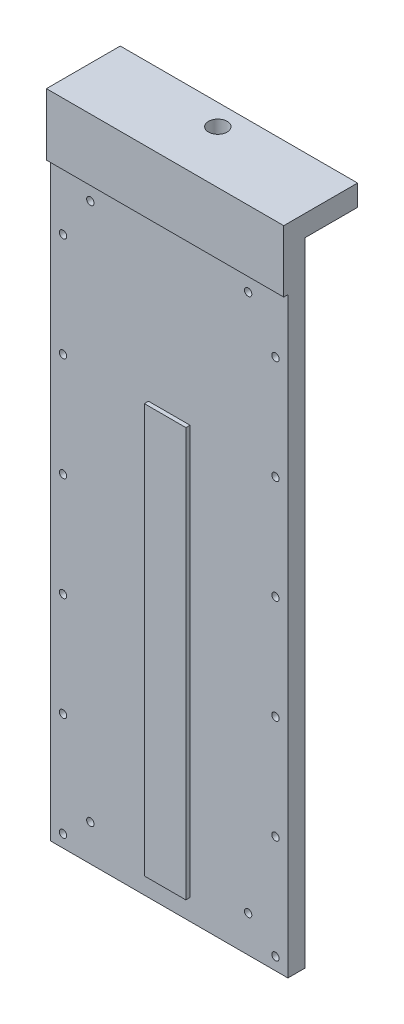
ISO-10303-21;
HEADER;
FILE_DESCRIPTION(('STEP AP214'),'2;1');
FILE_NAME('part.step','',(''),(''),'','','');
FILE_SCHEMA(('AUTOMOTIVE_DESIGN { 1 0 10303 214 1 1 1 1 }'));
ENDSEC;
DATA;
#1=APPLICATION_CONTEXT('core data for automotive mechanical design processes');
#2=APPLICATION_PROTOCOL_DEFINITION('international standard','automotive_design',2000,#1);
#3=PRODUCT_CONTEXT('',#1,'mechanical');
#4=PRODUCT('Part','Part','',(#3));
#5=PRODUCT_RELATED_PRODUCT_CATEGORY('part','',(#4));
#6=PRODUCT_DEFINITION_FORMATION('','',#4);
#7=PRODUCT_DEFINITION_CONTEXT('part definition',#1,'design');
#8=PRODUCT_DEFINITION('design','',#6,#7);
#9=PRODUCT_DEFINITION_SHAPE('','',#8);
#10=(LENGTH_UNIT() NAMED_UNIT(*) SI_UNIT(.MILLI.,.METRE.));
#11=(NAMED_UNIT(*) PLANE_ANGLE_UNIT() SI_UNIT($,.RADIAN.));
#12=(NAMED_UNIT(*) SI_UNIT($,.STERADIAN.) SOLID_ANGLE_UNIT());
#13=UNCERTAINTY_MEASURE_WITH_UNIT(LENGTH_MEASURE(1.E-05),#10,'distance_accuracy_value','');
#14=(GEOMETRIC_REPRESENTATION_CONTEXT(3) GLOBAL_UNCERTAINTY_ASSIGNED_CONTEXT((#13)) GLOBAL_UNIT_ASSIGNED_CONTEXT((#10,
#11,#12)) REPRESENTATION_CONTEXT('',''));
#15=CARTESIAN_POINT('',(0.,0.,0.));
#16=DIRECTION('',(0.,0.,1.));
#17=DIRECTION('',(1.,0.,0.));
#18=AXIS2_PLACEMENT_3D('',#15,#16,#17);
#19=CARTESIAN_POINT('',(-28.575,-152.4,2.54));
#20=DIRECTION('',(0.,0.,1.));
#21=DIRECTION('',(1.,0.,0.));
#22=AXIS2_PLACEMENT_3D('',#19,#20,#21);
#23=PLANE('',#22);
#24=DIRECTION('',(-1.,0.,0.));
#25=VECTOR('',#24,1.);
#26=CARTESIAN_POINT('',(28.575,-14.9,2.54));
#27=LINE('',#26,#25);
#28=CARTESIAN_POINT('',(28.575,-14.9,2.54));
#29=VERTEX_POINT('',#28);
#30=CARTESIAN_POINT('',(-28.575,-14.9,2.54));
#31=VERTEX_POINT('',#30);
#32=EDGE_CURVE('E240',#29,#31,#27,.T.);
#33=ORIENTED_EDGE('',*,*,#32,.F.);
#34=DIRECTION('',(0.,1.,0.));
#35=VECTOR('',#34,1.);
#36=CARTESIAN_POINT('',(28.575,-152.4,2.54));
#37=LINE('',#36,#35);
#38=CARTESIAN_POINT('',(28.575,0.,2.54));
#39=VERTEX_POINT('',#38);
#40=EDGE_CURVE('E53',#29,#39,#37,.T.);
#41=ORIENTED_EDGE('',*,*,#40,.T.);
#42=DIRECTION('',(1.,0.,0.));
#43=VECTOR('',#42,1.);
#44=CARTESIAN_POINT('',(-28.575,0.,2.54));
#45=LINE('',#44,#43);
#46=CARTESIAN_POINT('',(-28.575,0.,2.54));
#47=VERTEX_POINT('',#46);
#48=EDGE_CURVE('E295',#47,#39,#45,.T.);
#49=ORIENTED_EDGE('',*,*,#48,.F.);
#50=DIRECTION('',(0.,1.,0.));
#51=VECTOR('',#50,1.);
#52=CARTESIAN_POINT('',(-28.575,-152.4,2.54));
#53=LINE('',#52,#51);
#54=EDGE_CURVE('E146',#31,#47,#53,.T.);
#55=ORIENTED_EDGE('',*,*,#54,.F.);
#56=EDGE_LOOP('',(#33,#41,#49,#55));
#57=FACE_BOUND('',#56,.T.);
#58=ADVANCED_FACE('F43',(#57),#23,.T.);
#59=CARTESIAN_POINT('',(28.575,-152.4,2.54));
#60=DIRECTION('',(1.,0.,0.));
#61=DIRECTION('',(0.,0.,-1.));
#62=AXIS2_PLACEMENT_3D('',#59,#60,#61);
#63=PLANE('',#62);
#64=DIRECTION('',(0.,0.,1.));
#65=VECTOR('',#64,1.);
#66=CARTESIAN_POINT('',(28.575,-14.9,1.54));
#67=LINE('',#66,#65);
#68=CARTESIAN_POINT('',(28.575,-14.9,1.54));
#69=VERTEX_POINT('',#68);
#70=EDGE_CURVE('E276',#69,#29,#67,.T.);
#71=ORIENTED_EDGE('',*,*,#70,.F.);
#72=DIRECTION('',(0.,1.,0.));
#73=VECTOR('',#72,1.);
#74=CARTESIAN_POINT('',(28.575,-152.4,1.54));
#75=LINE('',#74,#73);
#76=CARTESIAN_POINT('',(28.575,-157.4,1.54));
#77=VERTEX_POINT('',#76);
#78=EDGE_CURVE('E248',#77,#69,#75,.T.);
#79=ORIENTED_EDGE('',*,*,#78,.F.);
#80=DIRECTION('',(0.,0.,1.));
#81=VECTOR('',#80,1.);
#82=CARTESIAN_POINT('',(28.575,-157.4,-2.54));
#83=LINE('',#82,#81);
#84=CARTESIAN_POINT('',(28.575,-157.4,-2.54));
#85=VERTEX_POINT('',#84);
#86=EDGE_CURVE('E156',#85,#77,#83,.T.);
#87=ORIENTED_EDGE('',*,*,#86,.F.);
#88=DIRECTION('',(0.,1.,0.));
#89=VECTOR('',#88,1.);
#90=CARTESIAN_POINT('',(28.575,-152.4,-2.54));
#91=LINE('',#90,#89);
#92=CARTESIAN_POINT('',(28.575,-5.08000000000006,-2.54));
#93=VERTEX_POINT('',#92);
#94=EDGE_CURVE('E147',#85,#93,#91,.T.);
#95=ORIENTED_EDGE('',*,*,#94,.T.);
#96=DIRECTION('',(0.,0.,1.));
#97=VECTOR('',#96,1.);
#98=CARTESIAN_POINT('',(28.575,-5.08,-15.24));
#99=LINE('',#98,#97);
#100=CARTESIAN_POINT('',(28.575,-5.08,-15.24));
#101=VERTEX_POINT('',#100);
#102=EDGE_CURVE('E230',#101,#93,#99,.T.);
#103=ORIENTED_EDGE('',*,*,#102,.F.);
#104=DIRECTION('',(0.,-1.,0.));
#105=VECTOR('',#104,1.);
#106=CARTESIAN_POINT('',(28.575,0.,-15.24));
#107=LINE('',#106,#105);
#108=CARTESIAN_POINT('',(28.575,0.,-15.24));
#109=VERTEX_POINT('',#108);
#110=EDGE_CURVE('E211',#109,#101,#107,.T.);
#111=ORIENTED_EDGE('',*,*,#110,.F.);
#112=DIRECTION('',(0.,0.,-1.));
#113=VECTOR('',#112,1.);
#114=CARTESIAN_POINT('',(28.575,0.,2.54));
#115=LINE('',#114,#113);
#116=EDGE_CURVE('E275',#39,#109,#115,.T.);
#117=ORIENTED_EDGE('',*,*,#116,.F.);
#118=ORIENTED_EDGE('',*,*,#40,.F.);
#119=EDGE_LOOP('',(#71,#79,#87,#95,#103,#111,#117,#118));
#120=FACE_BOUND('',#119,.T.);
#121=ADVANCED_FACE('F45',(#120),#63,.T.);
#122=DIRECTION('',(0.,-1.,0.));
#123=VECTOR('',#122,1.);
#124=CARTESIAN_POINT('',(5.,-53.9,2.54));
#125=LINE('',#124,#123);
#126=CARTESIAN_POINT('',(5.,-53.9,2.54));
#127=VERTEX_POINT('',#126);
#128=CARTESIAN_POINT('',(5.,-152.4,2.54));
#129=VERTEX_POINT('',#128);
#130=EDGE_CURVE('E267',#127,#129,#125,.T.);
#131=ORIENTED_EDGE('',*,*,#130,.F.);
#132=DIRECTION('',(1.,0.,0.));
#133=VECTOR('',#132,1.);
#134=CARTESIAN_POINT('',(-5.,-53.9,2.54));
#135=LINE('',#134,#133);
#136=CARTESIAN_POINT('',(-5.,-53.9,2.54));
#137=VERTEX_POINT('',#136);
#138=EDGE_CURVE('E263',#137,#127,#135,.T.);
#139=ORIENTED_EDGE('',*,*,#138,.F.);
#140=DIRECTION('',(0.,1.,0.));
#141=VECTOR('',#140,1.);
#142=CARTESIAN_POINT('',(-5.,-152.4,2.54));
#143=LINE('',#142,#141);
#144=CARTESIAN_POINT('',(-5.,-152.4,2.54));
#145=VERTEX_POINT('',#144);
#146=EDGE_CURVE('E234',#145,#137,#143,.T.);
#147=ORIENTED_EDGE('',*,*,#146,.F.);
#148=DIRECTION('',(1.,0.,0.));
#149=VECTOR('',#148,1.);
#150=CARTESIAN_POINT('',(-28.575,-152.4,2.54));
#151=LINE('',#150,#149);
#152=EDGE_CURVE('E291',#145,#129,#151,.T.);
#153=ORIENTED_EDGE('',*,*,#152,.T.);
#154=EDGE_LOOP('',(#131,#139,#147,#153));
#155=FACE_BOUND('',#154,.T.);
#156=ADVANCED_FACE('F351',(#155),#23,.T.);
#157=CARTESIAN_POINT('',(-28.575,-152.4,2.54));
#158=DIRECTION('',(-1.,0.,0.));
#159=DIRECTION('',(0.,0.,1.));
#160=AXIS2_PLACEMENT_3D('',#157,#158,#159);
#161=PLANE('',#160);
#162=DIRECTION('',(0.,0.,1.));
#163=VECTOR('',#162,1.);
#164=CARTESIAN_POINT('',(-28.575,-14.9,1.54));
#165=LINE('',#164,#163);
#166=CARTESIAN_POINT('',(-28.575,-14.9,1.54));
#167=VERTEX_POINT('',#166);
#168=EDGE_CURVE('E272',#167,#31,#165,.T.);
#169=ORIENTED_EDGE('',*,*,#168,.T.);
#170=ORIENTED_EDGE('',*,*,#54,.T.);
#171=DIRECTION('',(0.,0.,1.));
#172=VECTOR('',#171,1.);
#173=CARTESIAN_POINT('',(-28.575,0.,2.54));
#174=LINE('',#173,#172);
#175=CARTESIAN_POINT('',(-28.575,0.,-15.24));
#176=VERTEX_POINT('',#175);
#177=EDGE_CURVE('E298',#176,#47,#174,.T.);
#178=ORIENTED_EDGE('',*,*,#177,.F.);
#179=DIRECTION('',(0.,1.,0.));
#180=VECTOR('',#179,1.);
#181=CARTESIAN_POINT('',(-28.575,0.,-15.24));
#182=LINE('',#181,#180);
#183=CARTESIAN_POINT('',(-28.575,-5.08,-15.24));
#184=VERTEX_POINT('',#183);
#185=EDGE_CURVE('E218',#184,#176,#182,.T.);
#186=ORIENTED_EDGE('',*,*,#185,.F.);
#187=DIRECTION('',(0.,0.,1.));
#188=VECTOR('',#187,1.);
#189=CARTESIAN_POINT('',(-28.575,-5.08,-15.24));
#190=LINE('',#189,#188);
#191=CARTESIAN_POINT('',(-28.575,-5.08,-2.54));
#192=VERTEX_POINT('',#191);
#193=EDGE_CURVE('E144',#184,#192,#190,.T.);
#194=ORIENTED_EDGE('',*,*,#193,.T.);
#195=DIRECTION('',(0.,1.,0.));
#196=VECTOR('',#195,1.);
#197=CARTESIAN_POINT('',(-28.575,-152.4,-2.54));
#198=LINE('',#197,#196);
#199=CARTESIAN_POINT('',(-28.575,-157.4,-2.54));
#200=VERTEX_POINT('',#199);
#201=EDGE_CURVE('E135',#200,#192,#198,.T.);
#202=ORIENTED_EDGE('',*,*,#201,.F.);
#203=DIRECTION('',(0.,0.,-1.));
#204=VECTOR('',#203,1.);
#205=CARTESIAN_POINT('',(-28.575,-157.4,-2.54));
#206=LINE('',#205,#204);
#207=CARTESIAN_POINT('',(-28.575,-157.4,1.54));
#208=VERTEX_POINT('',#207);
#209=EDGE_CURVE('E141',#208,#200,#206,.T.);
#210=ORIENTED_EDGE('',*,*,#209,.F.);
#211=DIRECTION('',(0.,-1.,0.));
#212=VECTOR('',#211,1.);
#213=CARTESIAN_POINT('',(-28.575,-14.9,1.54));
#214=LINE('',#213,#212);
#215=EDGE_CURVE('E256',#167,#208,#214,.T.);
#216=ORIENTED_EDGE('',*,*,#215,.F.);
#217=EDGE_LOOP('',(#169,#170,#178,#186,#194,#202,#210,#216));
#218=FACE_BOUND('',#217,.T.);
#219=ADVANCED_FACE('F138',(#218),#161,.T.);
#220=CARTESIAN_POINT('',(-28.575,-152.4,-2.54));
#221=DIRECTION('',(0.,0.,-1.));
#222=DIRECTION('',(-1.,0.,0.));
#223=AXIS2_PLACEMENT_3D('',#220,#221,#222);
#224=PLANE('',#223);
#225=CARTESIAN_POINT('',(-25.575,-29.4,-2.54));
#226=DIRECTION('',(0.,0.,-1.));
#227=DIRECTION('',(-1.,0.,0.));
#228=AXIS2_PLACEMENT_3D('',#225,#226,#227);
#229=CIRCLE('',#228,0.88900000000001);
#230=CARTESIAN_POINT('',(-26.464,-29.4,-2.54));
#231=VERTEX_POINT('',#230);
#232=EDGE_CURVE('E386',#231,#231,#229,.T.);
#233=ORIENTED_EDGE('',*,*,#232,.F.);
#234=EDGE_LOOP('',(#233));
#235=FACE_BOUND('',#234,.T.);
#236=CARTESIAN_POINT('',(-25.575,-54.4,-2.54));
#237=DIRECTION('',(0.,0.,-1.));
#238=DIRECTION('',(-1.,0.,0.));
#239=AXIS2_PLACEMENT_3D('',#236,#237,#238);
#240=CIRCLE('',#239,0.88900000000001);
#241=CARTESIAN_POINT('',(-26.464,-54.4,-2.54));
#242=VERTEX_POINT('',#241);
#243=EDGE_CURVE('E390',#242,#242,#240,.T.);
#244=ORIENTED_EDGE('',*,*,#243,.F.);
#245=EDGE_LOOP('',(#244));
#246=FACE_BOUND('',#245,.T.);
#247=CARTESIAN_POINT('',(-25.575,-79.4,-2.54));
#248=DIRECTION('',(0.,0.,-1.));
#249=DIRECTION('',(-1.,0.,0.));
#250=AXIS2_PLACEMENT_3D('',#247,#248,#249);
#251=CIRCLE('',#250,0.88900000000001);
#252=CARTESIAN_POINT('',(-26.464,-79.4,-2.54));
#253=VERTEX_POINT('',#252);
#254=EDGE_CURVE('E394',#253,#253,#251,.T.);
#255=ORIENTED_EDGE('',*,*,#254,.F.);
#256=EDGE_LOOP('',(#255));
#257=FACE_BOUND('',#256,.T.);
#258=CARTESIAN_POINT('',(-25.575,-104.4,-2.54));
#259=DIRECTION('',(0.,0.,-1.));
#260=DIRECTION('',(-1.,0.,0.));
#261=AXIS2_PLACEMENT_3D('',#258,#259,#260);
#262=CIRCLE('',#261,0.88900000000001);
#263=CARTESIAN_POINT('',(-26.464,-104.4,-2.54));
#264=VERTEX_POINT('',#263);
#265=EDGE_CURVE('E398',#264,#264,#262,.T.);
#266=ORIENTED_EDGE('',*,*,#265,.F.);
#267=EDGE_LOOP('',(#266));
#268=FACE_BOUND('',#267,.T.);
#269=CARTESIAN_POINT('',(-25.575,-129.4,-2.54));
#270=DIRECTION('',(0.,0.,-1.));
#271=DIRECTION('',(-1.,0.,0.));
#272=AXIS2_PLACEMENT_3D('',#269,#270,#271);
#273=CIRCLE('',#272,0.88900000000001);
#274=CARTESIAN_POINT('',(-26.464,-129.4,-2.54));
#275=VERTEX_POINT('',#274);
#276=EDGE_CURVE('E402',#275,#275,#273,.T.);
#277=ORIENTED_EDGE('',*,*,#276,.F.);
#278=EDGE_LOOP('',(#277));
#279=FACE_BOUND('',#278,.T.);
#280=CARTESIAN_POINT('',(25.575,-29.4,-2.54));
#281=DIRECTION('',(0.,0.,-1.));
#282=DIRECTION('',(-1.,0.,0.));
#283=AXIS2_PLACEMENT_3D('',#280,#281,#282);
#284=CIRCLE('',#283,0.88900000000001);
#285=CARTESIAN_POINT('',(24.686,-29.4,-2.54));
#286=VERTEX_POINT('',#285);
#287=EDGE_CURVE('E406',#286,#286,#284,.F.);
#288=ORIENTED_EDGE('',*,*,#287,.T.);
#289=EDGE_LOOP('',(#288));
#290=FACE_BOUND('',#289,.T.);
#291=CARTESIAN_POINT('',(25.575,-54.4,-2.54));
#292=DIRECTION('',(0.,0.,-1.));
#293=DIRECTION('',(-1.,0.,0.));
#294=AXIS2_PLACEMENT_3D('',#291,#292,#293);
#295=CIRCLE('',#294,0.88900000000001);
#296=CARTESIAN_POINT('',(24.686,-54.4,-2.54));
#297=VERTEX_POINT('',#296);
#298=EDGE_CURVE('E410',#297,#297,#295,.F.);
#299=ORIENTED_EDGE('',*,*,#298,.T.);
#300=EDGE_LOOP('',(#299));
#301=FACE_BOUND('',#300,.T.);
#302=CARTESIAN_POINT('',(25.575,-79.4,-2.54));
#303=DIRECTION('',(0.,0.,-1.));
#304=DIRECTION('',(-1.,0.,0.));
#305=AXIS2_PLACEMENT_3D('',#302,#303,#304);
#306=CIRCLE('',#305,0.88900000000001);
#307=CARTESIAN_POINT('',(24.686,-79.4,-2.54));
#308=VERTEX_POINT('',#307);
#309=EDGE_CURVE('E414',#308,#308,#306,.F.);
#310=ORIENTED_EDGE('',*,*,#309,.T.);
#311=EDGE_LOOP('',(#310));
#312=FACE_BOUND('',#311,.T.);
#313=CARTESIAN_POINT('',(25.575,-104.4,-2.54));
#314=DIRECTION('',(0.,0.,-1.));
#315=DIRECTION('',(-1.,0.,0.));
#316=AXIS2_PLACEMENT_3D('',#313,#314,#315);
#317=CIRCLE('',#316,0.88900000000001);
#318=CARTESIAN_POINT('',(24.686,-104.4,-2.54));
#319=VERTEX_POINT('',#318);
#320=EDGE_CURVE('E418',#319,#319,#317,.F.);
#321=ORIENTED_EDGE('',*,*,#320,.T.);
#322=EDGE_LOOP('',(#321));
#323=FACE_BOUND('',#322,.T.);
#324=CARTESIAN_POINT('',(25.575,-129.4,-2.54));
#325=DIRECTION('',(0.,0.,-1.));
#326=DIRECTION('',(-1.,0.,0.));
#327=AXIS2_PLACEMENT_3D('',#324,#325,#326);
#328=CIRCLE('',#327,0.88900000000001);
#329=CARTESIAN_POINT('',(24.686,-129.4,-2.54));
#330=VERTEX_POINT('',#329);
#331=EDGE_CURVE('E422',#330,#330,#328,.F.);
#332=ORIENTED_EDGE('',*,*,#331,.T.);
#333=EDGE_LOOP('',(#332));
#334=FACE_BOUND('',#333,.T.);
#335=CARTESIAN_POINT('',(25.575,-154.4,-2.54));
#336=DIRECTION('',(0.,0.,-1.));
#337=DIRECTION('',(-1.,0.,0.));
#338=AXIS2_PLACEMENT_3D('',#335,#336,#337);
#339=CIRCLE('',#338,0.88900000000001);
#340=CARTESIAN_POINT('',(24.686,-154.4,-2.54));
#341=VERTEX_POINT('',#340);
#342=EDGE_CURVE('E426',#341,#341,#339,.F.);
#343=ORIENTED_EDGE('',*,*,#342,.T.);
#344=EDGE_LOOP('',(#343));
#345=FACE_BOUND('',#344,.T.);
#346=CARTESIAN_POINT('',(-25.575,-154.4,-2.54));
#347=DIRECTION('',(0.,0.,-1.));
#348=DIRECTION('',(-1.,0.,0.));
#349=AXIS2_PLACEMENT_3D('',#346,#347,#348);
#350=CIRCLE('',#349,0.88900000000001);
#351=CARTESIAN_POINT('',(-26.464,-154.4,-2.54));
#352=VERTEX_POINT('',#351);
#353=EDGE_CURVE('E163',#352,#352,#350,.T.);
#354=ORIENTED_EDGE('',*,*,#353,.F.);
#355=EDGE_LOOP('',(#354));
#356=FACE_BOUND('',#355,.T.);
#357=CARTESIAN_POINT('',(19.,-19.15,-2.54));
#358=DIRECTION('',(0.,0.,-1.));
#359=DIRECTION('',(-1.,0.,0.));
#360=AXIS2_PLACEMENT_3D('',#357,#358,#359);
#361=CIRCLE('',#360,0.888999999999997);
#362=CARTESIAN_POINT('',(18.111,-19.15,-2.54));
#363=VERTEX_POINT('',#362);
#364=EDGE_CURVE('E203',#363,#363,#361,.T.);
#365=ORIENTED_EDGE('',*,*,#364,.F.);
#366=EDGE_LOOP('',(#365));
#367=FACE_BOUND('',#366,.T.);
#368=CARTESIAN_POINT('',(-19.,-148.65,-2.54));
#369=DIRECTION('',(0.,0.,-1.));
#370=DIRECTION('',(-1.,0.,0.));
#371=AXIS2_PLACEMENT_3D('',#368,#369,#370);
#372=CIRCLE('',#371,0.88900000000001);
#373=CARTESIAN_POINT('',(-19.889,-148.65,-2.54));
#374=VERTEX_POINT('',#373);
#375=EDGE_CURVE('E199',#374,#374,#372,.T.);
#376=ORIENTED_EDGE('',*,*,#375,.F.);
#377=EDGE_LOOP('',(#376));
#378=FACE_BOUND('',#377,.T.);
#379=CARTESIAN_POINT('',(19.,-148.65,-2.54));
#380=DIRECTION('',(0.,0.,-1.));
#381=DIRECTION('',(-1.,0.,0.));
#382=AXIS2_PLACEMENT_3D('',#379,#380,#381);
#383=CIRCLE('',#382,0.88900000000001);
#384=CARTESIAN_POINT('',(18.111,-148.65,-2.54));
#385=VERTEX_POINT('',#384);
#386=EDGE_CURVE('E195',#385,#385,#383,.T.);
#387=ORIENTED_EDGE('',*,*,#386,.F.);
#388=EDGE_LOOP('',(#387));
#389=FACE_BOUND('',#388,.T.);
#390=CARTESIAN_POINT('',(-19.,-19.15,-2.54));
#391=DIRECTION('',(0.,0.,-1.));
#392=DIRECTION('',(-1.,0.,0.));
#393=AXIS2_PLACEMENT_3D('',#390,#391,#392);
#394=CIRCLE('',#393,0.888999999999997);
#395=CARTESIAN_POINT('',(-19.889,-19.15,-2.54));
#396=VERTEX_POINT('',#395);
#397=EDGE_CURVE('E191',#396,#396,#394,.T.);
#398=ORIENTED_EDGE('',*,*,#397,.F.);
#399=EDGE_LOOP('',(#398));
#400=FACE_BOUND('',#399,.T.);
#401=DIRECTION('',(-1.,0.,0.));
#402=VECTOR('',#401,1.);
#403=CARTESIAN_POINT('',(28.575,-5.08,-2.54));
#404=LINE('',#403,#402);
#405=EDGE_CURVE('E61',#93,#192,#404,.T.);
#406=ORIENTED_EDGE('',*,*,#405,.F.);
#407=ORIENTED_EDGE('',*,*,#94,.F.);
#408=DIRECTION('',(1.,0.,0.));
#409=VECTOR('',#408,1.);
#410=CARTESIAN_POINT('',(-28.575,-157.4,-2.54));
#411=LINE('',#410,#409);
#412=EDGE_CURVE('E150',#200,#85,#411,.T.);
#413=ORIENTED_EDGE('',*,*,#412,.F.);
#414=ORIENTED_EDGE('',*,*,#201,.T.);
#415=EDGE_LOOP('',(#406,#407,#413,#414));
#416=FACE_BOUND('',#415,.T.);
#417=ADVANCED_FACE('F151',(#235,#246,#257,#268,#279,#290,#301,#312,#323,#334,#345,#356,#367,
#378,#389,#400,#416),#224,.T.);
#418=CARTESIAN_POINT('',(0.,-152.4,0.));
#419=DIRECTION('',(0.,-1.,0.));
#420=DIRECTION('',(0.,0.,-1.));
#421=AXIS2_PLACEMENT_3D('',#418,#419,#420);
#422=PLANE('',#421);
#423=DIRECTION('',(-1.,0.,0.));
#424=VECTOR('',#423,1.);
#425=CARTESIAN_POINT('',(-28.575,-152.4,1.54));
#426=LINE('',#425,#424);
#427=CARTESIAN_POINT('',(4.99999999999997,-152.4,1.54));
#428=VERTEX_POINT('',#427);
#429=CARTESIAN_POINT('',(-5.,-152.4,1.54));
#430=VERTEX_POINT('',#429);
#431=EDGE_CURVE('E11',#428,#430,#426,.T.);
#432=ORIENTED_EDGE('',*,*,#431,.F.);
#433=DIRECTION('',(0.,0.,1.));
#434=VECTOR('',#433,1.);
#435=CARTESIAN_POINT('',(5.,-152.4,1.54));
#436=LINE('',#435,#434);
#437=EDGE_CURVE('E279',#428,#129,#436,.T.);
#438=ORIENTED_EDGE('',*,*,#437,.T.);
#439=ORIENTED_EDGE('',*,*,#152,.F.);
#440=DIRECTION('',(0.,0.,1.));
#441=VECTOR('',#440,1.);
#442=CARTESIAN_POINT('',(-5.,-152.4,1.54));
#443=LINE('',#442,#441);
#444=EDGE_CURVE('E259',#430,#145,#443,.T.);
#445=ORIENTED_EDGE('',*,*,#444,.F.);
#446=EDGE_LOOP('',(#432,#438,#439,#445));
#447=FACE_BOUND('',#446,.T.);
#448=ADVANCED_FACE('F347',(#447),#422,.T.);
#449=CARTESIAN_POINT('',(0.,0.,0.));
#450=DIRECTION('',(0.,-1.,0.));
#451=DIRECTION('',(0.,0.,-1.));
#452=AXIS2_PLACEMENT_3D('',#449,#450,#451);
#453=PLANE('',#452);
#454=CARTESIAN_POINT('',(0.,0.,-10.16));
#455=DIRECTION('',(0.,1.,0.));
#456=DIRECTION('',(0.,0.,1.));
#457=AXIS2_PLACEMENT_3D('',#454,#455,#456);
#458=CIRCLE('',#457,2.25);
#459=CARTESIAN_POINT('',(0.,0.,-7.91));
#460=VERTEX_POINT('',#459);
#461=EDGE_CURVE('E207',#460,#460,#458,.T.);
#462=ORIENTED_EDGE('',*,*,#461,.F.);
#463=EDGE_LOOP('',(#462));
#464=FACE_BOUND('',#463,.T.);
#465=ORIENTED_EDGE('',*,*,#116,.T.);
#466=DIRECTION('',(1.,0.,0.));
#467=VECTOR('',#466,1.);
#468=CARTESIAN_POINT('',(28.575,0.,-15.24));
#469=LINE('',#468,#467);
#470=EDGE_CURVE('E222',#176,#109,#469,.T.);
#471=ORIENTED_EDGE('',*,*,#470,.F.);
#472=ORIENTED_EDGE('',*,*,#177,.T.);
#473=ORIENTED_EDGE('',*,*,#48,.T.);
#474=EDGE_LOOP('',(#465,#471,#472,#473));
#475=FACE_BOUND('',#474,.T.);
#476=ADVANCED_FACE('F319',(#464,#475),#453,.F.);
#477=CARTESIAN_POINT('',(28.575,-14.9,1.54));
#478=DIRECTION('',(0.,1.,0.));
#479=DIRECTION('',(0.,0.,1.));
#480=AXIS2_PLACEMENT_3D('',#477,#478,#479);
#481=PLANE('',#480);
#482=ORIENTED_EDGE('',*,*,#32,.T.);
#483=ORIENTED_EDGE('',*,*,#168,.F.);
#484=DIRECTION('',(-1.,0.,0.));
#485=VECTOR('',#484,1.);
#486=CARTESIAN_POINT('',(28.575,-14.9,1.54));
#487=LINE('',#486,#485);
#488=EDGE_CURVE('E252',#69,#167,#487,.T.);
#489=ORIENTED_EDGE('',*,*,#488,.F.);
#490=ORIENTED_EDGE('',*,*,#70,.T.);
#491=EDGE_LOOP('',(#482,#483,#489,#490));
#492=FACE_BOUND('',#491,.T.);
#493=ADVANCED_FACE('F322',(#492),#481,.F.);
#494=CARTESIAN_POINT('',(5.,-53.9,1.54));
#495=DIRECTION('',(-1.,0.,0.));
#496=DIRECTION('',(0.,-1.,0.));
#497=AXIS2_PLACEMENT_3D('',#494,#495,#496);
#498=PLANE('',#497);
#499=ORIENTED_EDGE('',*,*,#130,.T.);
#500=ORIENTED_EDGE('',*,*,#437,.F.);
#501=DIRECTION('',(0.,-1.,0.));
#502=VECTOR('',#501,1.);
#503=CARTESIAN_POINT('',(5.,-53.9,1.54));
#504=LINE('',#503,#502);
#505=CARTESIAN_POINT('',(5.,-53.9,1.54));
#506=VERTEX_POINT('',#505);
#507=EDGE_CURVE('E244',#506,#428,#504,.T.);
#508=ORIENTED_EDGE('',*,*,#507,.F.);
#509=DIRECTION('',(0.,0.,1.));
#510=VECTOR('',#509,1.);
#511=CARTESIAN_POINT('',(5.,-53.9,1.54));
#512=LINE('',#511,#510);
#513=EDGE_CURVE('E283',#506,#127,#512,.T.);
#514=ORIENTED_EDGE('',*,*,#513,.T.);
#515=EDGE_LOOP('',(#499,#500,#508,#514));
#516=FACE_BOUND('',#515,.T.);
#517=ADVANCED_FACE('F343',(#516),#498,.F.);
#518=CARTESIAN_POINT('',(-5.,-53.9,1.54));
#519=DIRECTION('',(0.,-1.,0.));
#520=DIRECTION('',(0.,0.,-1.));
#521=AXIS2_PLACEMENT_3D('',#518,#519,#520);
#522=PLANE('',#521);
#523=ORIENTED_EDGE('',*,*,#138,.T.);
#524=ORIENTED_EDGE('',*,*,#513,.F.);
#525=DIRECTION('',(1.,0.,0.));
#526=VECTOR('',#525,1.);
#527=CARTESIAN_POINT('',(-5.,-53.9,1.54));
#528=LINE('',#527,#526);
#529=CARTESIAN_POINT('',(-5.,-53.9,1.54));
#530=VERTEX_POINT('',#529);
#531=EDGE_CURVE('E239',#530,#506,#528,.T.);
#532=ORIENTED_EDGE('',*,*,#531,.F.);
#533=DIRECTION('',(0.,0.,1.));
#534=VECTOR('',#533,1.);
#535=CARTESIAN_POINT('',(-5.,-53.9,1.54));
#536=LINE('',#535,#534);
#537=EDGE_CURVE('E286',#530,#137,#536,.T.);
#538=ORIENTED_EDGE('',*,*,#537,.T.);
#539=EDGE_LOOP('',(#523,#524,#532,#538));
#540=FACE_BOUND('',#539,.T.);
#541=ADVANCED_FACE('F355',(#540),#522,.F.);
#542=CARTESIAN_POINT('',(-5.,-152.4,1.54));
#543=DIRECTION('',(1.,0.,0.));
#544=DIRECTION('',(0.,0.,-1.));
#545=AXIS2_PLACEMENT_3D('',#542,#543,#544);
#546=PLANE('',#545);
#547=ORIENTED_EDGE('',*,*,#146,.T.);
#548=ORIENTED_EDGE('',*,*,#537,.F.);
#549=DIRECTION('',(0.,1.,0.));
#550=VECTOR('',#549,1.);
#551=CARTESIAN_POINT('',(-5.,-152.4,1.54));
#552=LINE('',#551,#550);
#553=EDGE_CURVE('E235',#430,#530,#552,.T.);
#554=ORIENTED_EDGE('',*,*,#553,.F.);
#555=ORIENTED_EDGE('',*,*,#444,.T.);
#556=EDGE_LOOP('',(#547,#548,#554,#555));
#557=FACE_BOUND('',#556,.T.);
#558=ADVANCED_FACE('F327',(#557),#546,.F.);
#559=CARTESIAN_POINT('',(0.,0.,1.54));
#560=DIRECTION('',(0.,0.,1.));
#561=DIRECTION('',(1.,0.,0.));
#562=AXIS2_PLACEMENT_3D('',#559,#560,#561);
#563=PLANE('',#562);
#564=CARTESIAN_POINT('',(-25.575,-29.4,1.54));
#565=DIRECTION('',(0.,0.,1.));
#566=DIRECTION('',(1.,0.,0.));
#567=AXIS2_PLACEMENT_3D('',#564,#565,#566);
#568=CIRCLE('',#567,0.88900000000001);
#569=CARTESIAN_POINT('',(-24.686,-29.4,1.54));
#570=VERTEX_POINT('',#569);
#571=EDGE_CURVE('E793',#570,#570,#568,.T.);
#572=ORIENTED_EDGE('',*,*,#571,.F.);
#573=EDGE_LOOP('',(#572));
#574=FACE_BOUND('',#573,.T.);
#575=CARTESIAN_POINT('',(-25.575,-54.4,1.54));
#576=DIRECTION('',(0.,0.,1.));
#577=DIRECTION('',(1.,0.,0.));
#578=AXIS2_PLACEMENT_3D('',#575,#576,#577);
#579=CIRCLE('',#578,0.88900000000001);
#580=CARTESIAN_POINT('',(-24.686,-54.4,1.54));
#581=VERTEX_POINT('',#580);
#582=EDGE_CURVE('E798',#581,#581,#579,.T.);
#583=ORIENTED_EDGE('',*,*,#582,.F.);
#584=EDGE_LOOP('',(#583));
#585=FACE_BOUND('',#584,.T.);
#586=CARTESIAN_POINT('',(-25.575,-79.4,1.54));
#587=DIRECTION('',(0.,0.,1.));
#588=DIRECTION('',(1.,0.,0.));
#589=AXIS2_PLACEMENT_3D('',#586,#587,#588);
#590=CIRCLE('',#589,0.88900000000001);
#591=CARTESIAN_POINT('',(-24.686,-79.4,1.54));
#592=VERTEX_POINT('',#591);
#593=EDGE_CURVE('E807',#592,#592,#590,.T.);
#594=ORIENTED_EDGE('',*,*,#593,.F.);
#595=EDGE_LOOP('',(#594));
#596=FACE_BOUND('',#595,.T.);
#597=CARTESIAN_POINT('',(-25.575,-104.4,1.54));
#598=DIRECTION('',(0.,0.,1.));
#599=DIRECTION('',(1.,0.,0.));
#600=AXIS2_PLACEMENT_3D('',#597,#598,#599);
#601=CIRCLE('',#600,0.88900000000001);
#602=CARTESIAN_POINT('',(-24.686,-104.4,1.54));
#603=VERTEX_POINT('',#602);
#604=EDGE_CURVE('E813',#603,#603,#601,.T.);
#605=ORIENTED_EDGE('',*,*,#604,.F.);
#606=EDGE_LOOP('',(#605));
#607=FACE_BOUND('',#606,.T.);
#608=CARTESIAN_POINT('',(-25.575,-129.4,1.54));
#609=DIRECTION('',(0.,0.,1.));
#610=DIRECTION('',(1.,0.,0.));
#611=AXIS2_PLACEMENT_3D('',#608,#609,#610);
#612=CIRCLE('',#611,0.88900000000001);
#613=CARTESIAN_POINT('',(-24.686,-129.4,1.54));
#614=VERTEX_POINT('',#613);
#615=EDGE_CURVE('E819',#614,#614,#612,.T.);
#616=ORIENTED_EDGE('',*,*,#615,.F.);
#617=EDGE_LOOP('',(#616));
#618=FACE_BOUND('',#617,.T.);
#619=CARTESIAN_POINT('',(25.575,-29.4,1.54));
#620=DIRECTION('',(0.,0.,-1.));
#621=DIRECTION('',(-1.,0.,0.));
#622=AXIS2_PLACEMENT_3D('',#619,#620,#621);
#623=CIRCLE('',#622,0.88900000000001);
#624=CARTESIAN_POINT('',(24.686,-29.4,1.54));
#625=VERTEX_POINT('',#624);
#626=EDGE_CURVE('E823',#625,#625,#623,.T.);
#627=ORIENTED_EDGE('',*,*,#626,.T.);
#628=EDGE_LOOP('',(#627));
#629=FACE_BOUND('',#628,.T.);
#630=CARTESIAN_POINT('',(25.575,-54.4,1.54));
#631=DIRECTION('',(0.,0.,-1.));
#632=DIRECTION('',(-1.,0.,0.));
#633=AXIS2_PLACEMENT_3D('',#630,#631,#632);
#634=CIRCLE('',#633,0.88900000000001);
#635=CARTESIAN_POINT('',(24.686,-54.4,1.54));
#636=VERTEX_POINT('',#635);
#637=EDGE_CURVE('E829',#636,#636,#634,.T.);
#638=ORIENTED_EDGE('',*,*,#637,.T.);
#639=EDGE_LOOP('',(#638));
#640=FACE_BOUND('',#639,.T.);
#641=CARTESIAN_POINT('',(25.575,-79.4,1.54));
#642=DIRECTION('',(0.,0.,-1.));
#643=DIRECTION('',(-1.,0.,0.));
#644=AXIS2_PLACEMENT_3D('',#641,#642,#643);
#645=CIRCLE('',#644,0.88900000000001);
#646=CARTESIAN_POINT('',(24.686,-79.4,1.54));
#647=VERTEX_POINT('',#646);
#648=EDGE_CURVE('E835',#647,#647,#645,.T.);
#649=ORIENTED_EDGE('',*,*,#648,.T.);
#650=EDGE_LOOP('',(#649));
#651=FACE_BOUND('',#650,.T.);
#652=CARTESIAN_POINT('',(25.575,-104.4,1.54));
#653=DIRECTION('',(0.,0.,-1.));
#654=DIRECTION('',(-1.,0.,0.));
#655=AXIS2_PLACEMENT_3D('',#652,#653,#654);
#656=CIRCLE('',#655,0.88900000000001);
#657=CARTESIAN_POINT('',(24.686,-104.4,1.54));
#658=VERTEX_POINT('',#657);
#659=EDGE_CURVE('E841',#658,#658,#656,.T.);
#660=ORIENTED_EDGE('',*,*,#659,.T.);
#661=EDGE_LOOP('',(#660));
#662=FACE_BOUND('',#661,.T.);
#663=CARTESIAN_POINT('',(25.575,-129.4,1.54));
#664=DIRECTION('',(0.,0.,-1.));
#665=DIRECTION('',(-1.,0.,0.));
#666=AXIS2_PLACEMENT_3D('',#663,#664,#665);
#667=CIRCLE('',#666,0.88900000000001);
#668=CARTESIAN_POINT('',(24.686,-129.4,1.54));
#669=VERTEX_POINT('',#668);
#670=EDGE_CURVE('E847',#669,#669,#667,.T.);
#671=ORIENTED_EDGE('',*,*,#670,.T.);
#672=EDGE_LOOP('',(#671));
#673=FACE_BOUND('',#672,.T.);
#674=CARTESIAN_POINT('',(25.575,-154.4,1.54));
#675=DIRECTION('',(0.,0.,-1.));
#676=DIRECTION('',(-1.,0.,0.));
#677=AXIS2_PLACEMENT_3D('',#674,#675,#676);
#678=CIRCLE('',#677,0.88900000000001);
#679=CARTESIAN_POINT('',(24.686,-154.4,1.54));
#680=VERTEX_POINT('',#679);
#681=EDGE_CURVE('E853',#680,#680,#678,.T.);
#682=ORIENTED_EDGE('',*,*,#681,.T.);
#683=EDGE_LOOP('',(#682));
#684=FACE_BOUND('',#683,.T.);
#685=CARTESIAN_POINT('',(-25.575,-154.4,1.54));
#686=DIRECTION('',(0.,0.,1.));
#687=DIRECTION('',(1.,0.,0.));
#688=AXIS2_PLACEMENT_3D('',#685,#686,#687);
#689=CIRCLE('',#688,0.88900000000001);
#690=CARTESIAN_POINT('',(-24.686,-154.4,1.54));
#691=VERTEX_POINT('',#690);
#692=EDGE_CURVE('E167',#691,#691,#689,.T.);
#693=ORIENTED_EDGE('',*,*,#692,.F.);
#694=EDGE_LOOP('',(#693));
#695=FACE_BOUND('',#694,.T.);
#696=DIRECTION('',(-1.,0.,0.));
#697=VECTOR('',#696,1.);
#698=CARTESIAN_POINT('',(-28.575,-157.4,1.54));
#699=LINE('',#698,#697);
#700=EDGE_CURVE('E161',#77,#208,#699,.T.);
#701=ORIENTED_EDGE('',*,*,#700,.F.);
#702=ORIENTED_EDGE('',*,*,#78,.T.);
#703=ORIENTED_EDGE('',*,*,#488,.T.);
#704=ORIENTED_EDGE('',*,*,#215,.T.);
#705=EDGE_LOOP('',(#701,#702,#703,#704));
#706=FACE_BOUND('',#705,.T.);
#707=CARTESIAN_POINT('',(19.,-19.15,1.54));
#708=DIRECTION('',(0.,0.,1.));
#709=DIRECTION('',(1.,0.,0.));
#710=AXIS2_PLACEMENT_3D('',#707,#708,#709);
#711=CIRCLE('',#710,0.888999999999997);
#712=CARTESIAN_POINT('',(19.889,-19.15,1.54));
#713=VERTEX_POINT('',#712);
#714=EDGE_CURVE('E180',#713,#713,#711,.T.);
#715=ORIENTED_EDGE('',*,*,#714,.F.);
#716=EDGE_LOOP('',(#715));
#717=FACE_BOUND('',#716,.T.);
#718=CARTESIAN_POINT('',(-19.,-148.65,1.54));
#719=DIRECTION('',(0.,0.,1.));
#720=DIRECTION('',(1.,0.,0.));
#721=AXIS2_PLACEMENT_3D('',#718,#719,#720);
#722=CIRCLE('',#721,0.88900000000001);
#723=CARTESIAN_POINT('',(-18.111,-148.65,1.54));
#724=VERTEX_POINT('',#723);
#725=EDGE_CURVE('E179',#724,#724,#722,.T.);
#726=ORIENTED_EDGE('',*,*,#725,.F.);
#727=EDGE_LOOP('',(#726));
#728=FACE_BOUND('',#727,.T.);
#729=CARTESIAN_POINT('',(19.,-148.65,1.54));
#730=DIRECTION('',(0.,0.,1.));
#731=DIRECTION('',(1.,0.,0.));
#732=AXIS2_PLACEMENT_3D('',#729,#730,#731);
#733=CIRCLE('',#732,0.88900000000001);
#734=CARTESIAN_POINT('',(19.889,-148.65,1.54));
#735=VERTEX_POINT('',#734);
#736=EDGE_CURVE('E174',#735,#735,#733,.T.);
#737=ORIENTED_EDGE('',*,*,#736,.F.);
#738=EDGE_LOOP('',(#737));
#739=FACE_BOUND('',#738,.T.);
#740=CARTESIAN_POINT('',(-19.,-19.15,1.54));
#741=DIRECTION('',(0.,0.,1.));
#742=DIRECTION('',(1.,0.,0.));
#743=AXIS2_PLACEMENT_3D('',#740,#741,#742);
#744=CIRCLE('',#743,0.888999999999997);
#745=CARTESIAN_POINT('',(-18.111,-19.15,1.54));
#746=VERTEX_POINT('',#745);
#747=EDGE_CURVE('E184',#746,#746,#744,.T.);
#748=ORIENTED_EDGE('',*,*,#747,.F.);
#749=EDGE_LOOP('',(#748));
#750=FACE_BOUND('',#749,.T.);
#751=ORIENTED_EDGE('',*,*,#507,.T.);
#752=ORIENTED_EDGE('',*,*,#431,.T.);
#753=ORIENTED_EDGE('',*,*,#553,.T.);
#754=ORIENTED_EDGE('',*,*,#531,.T.);
#755=EDGE_LOOP('',(#751,#752,#753,#754));
#756=FACE_BOUND('',#755,.T.);
#757=ADVANCED_FACE('F324',(#574,#585,#596,#607,#618,#629,#640,#651,#662,#673,#684,#695,#706,
#717,#728,#739,#750,#756),#563,.T.);
#758=CARTESIAN_POINT('',(28.575,-5.08,-15.24));
#759=DIRECTION('',(0.,1.,0.));
#760=DIRECTION('',(0.,0.,1.));
#761=AXIS2_PLACEMENT_3D('',#758,#759,#760);
#762=PLANE('',#761);
#763=CARTESIAN_POINT('',(0.,-5.08,-10.16));
#764=DIRECTION('',(0.,1.,0.));
#765=DIRECTION('',(0.,0.,1.));
#766=AXIS2_PLACEMENT_3D('',#763,#764,#765);
#767=CIRCLE('',#766,2.25);
#768=CARTESIAN_POINT('',(0.,-5.08,-7.91));
#769=VERTEX_POINT('',#768);
#770=EDGE_CURVE('E47',#769,#769,#767,.T.);
#771=ORIENTED_EDGE('',*,*,#770,.T.);
#772=EDGE_LOOP('',(#771));
#773=FACE_BOUND('',#772,.T.);
#774=ORIENTED_EDGE('',*,*,#405,.T.);
#775=ORIENTED_EDGE('',*,*,#193,.F.);
#776=DIRECTION('',(-1.,0.,0.));
#777=VECTOR('',#776,1.);
#778=CARTESIAN_POINT('',(28.575,-5.08,-15.24));
#779=LINE('',#778,#777);
#780=EDGE_CURVE('E215',#101,#184,#779,.T.);
#781=ORIENTED_EDGE('',*,*,#780,.F.);
#782=ORIENTED_EDGE('',*,*,#102,.T.);
#783=EDGE_LOOP('',(#774,#775,#781,#782));
#784=FACE_BOUND('',#783,.T.);
#785=ADVANCED_FACE('F314',(#773,#784),#762,.F.);
#786=CARTESIAN_POINT('',(0.,0.,-15.24));
#787=DIRECTION('',(0.,0.,-1.));
#788=DIRECTION('',(-1.,0.,0.));
#789=AXIS2_PLACEMENT_3D('',#786,#787,#788);
#790=PLANE('',#789);
#791=ORIENTED_EDGE('',*,*,#110,.T.);
#792=ORIENTED_EDGE('',*,*,#780,.T.);
#793=ORIENTED_EDGE('',*,*,#185,.T.);
#794=ORIENTED_EDGE('',*,*,#470,.T.);
#795=EDGE_LOOP('',(#791,#792,#793,#794));
#796=FACE_BOUND('',#795,.T.);
#797=ADVANCED_FACE('F316',(#796),#790,.T.);
#798=CARTESIAN_POINT('',(0.,-12.7,-10.16));
#799=DIRECTION('',(0.,1.,0.));
#800=DIRECTION('',(0.,0.,1.));
#801=AXIS2_PLACEMENT_3D('',#798,#799,#800);
#802=CYLINDRICAL_SURFACE('',#801,2.25);
#803=ORIENTED_EDGE('',*,*,#461,.T.);
#804=EDGE_LOOP('',(#803));
#805=FACE_BOUND('',#804,.T.);
#806=ORIENTED_EDGE('',*,*,#770,.F.);
#807=EDGE_LOOP('',(#806));
#808=FACE_BOUND('',#807,.T.);
#809=ADVANCED_FACE('F441',(#805,#808),#802,.F.);
#810=CARTESIAN_POINT('',(-19.,-19.15,-15.24));
#811=DIRECTION('',(0.,0.,1.));
#812=DIRECTION('',(1.,0.,0.));
#813=AXIS2_PLACEMENT_3D('',#810,#811,#812);
#814=CYLINDRICAL_SURFACE('',#813,0.888999999999997);
#815=ORIENTED_EDGE('',*,*,#397,.T.);
#816=EDGE_LOOP('',(#815));
#817=FACE_BOUND('',#816,.T.);
#818=ORIENTED_EDGE('',*,*,#747,.T.);
#819=EDGE_LOOP('',(#818));
#820=FACE_BOUND('',#819,.T.);
#821=ADVANCED_FACE('F437',(#817,#820),#814,.F.);
#822=CARTESIAN_POINT('',(19.,-148.65,-15.24));
#823=DIRECTION('',(0.,0.,1.));
#824=DIRECTION('',(1.,0.,0.));
#825=AXIS2_PLACEMENT_3D('',#822,#823,#824);
#826=CYLINDRICAL_SURFACE('',#825,0.88900000000001);
#827=ORIENTED_EDGE('',*,*,#386,.T.);
#828=EDGE_LOOP('',(#827));
#829=FACE_BOUND('',#828,.T.);
#830=ORIENTED_EDGE('',*,*,#736,.T.);
#831=EDGE_LOOP('',(#830));
#832=FACE_BOUND('',#831,.T.);
#833=ADVANCED_FACE('F440',(#829,#832),#826,.F.);
#834=CARTESIAN_POINT('',(-19.,-148.65,-15.24));
#835=DIRECTION('',(0.,0.,1.));
#836=DIRECTION('',(1.,0.,0.));
#837=AXIS2_PLACEMENT_3D('',#834,#835,#836);
#838=CYLINDRICAL_SURFACE('',#837,0.88900000000001);
#839=ORIENTED_EDGE('',*,*,#375,.T.);
#840=EDGE_LOOP('',(#839));
#841=FACE_BOUND('',#840,.T.);
#842=ORIENTED_EDGE('',*,*,#725,.T.);
#843=EDGE_LOOP('',(#842));
#844=FACE_BOUND('',#843,.T.);
#845=ADVANCED_FACE('F447',(#841,#844),#838,.F.);
#846=CARTESIAN_POINT('',(19.,-19.15,-15.24));
#847=DIRECTION('',(0.,0.,1.));
#848=DIRECTION('',(1.,0.,0.));
#849=AXIS2_PLACEMENT_3D('',#846,#847,#848);
#850=CYLINDRICAL_SURFACE('',#849,0.888999999999997);
#851=ORIENTED_EDGE('',*,*,#364,.T.);
#852=EDGE_LOOP('',(#851));
#853=FACE_BOUND('',#852,.T.);
#854=ORIENTED_EDGE('',*,*,#714,.T.);
#855=EDGE_LOOP('',(#854));
#856=FACE_BOUND('',#855,.T.);
#857=ADVANCED_FACE('F511',(#853,#856),#850,.F.);
#858=CARTESIAN_POINT('',(0.,-157.4,0.));
#859=DIRECTION('',(0.,1.,0.));
#860=DIRECTION('',(0.,0.,1.));
#861=AXIS2_PLACEMENT_3D('',#858,#859,#860);
#862=PLANE('',#861);
#863=ORIENTED_EDGE('',*,*,#209,.T.);
#864=ORIENTED_EDGE('',*,*,#412,.T.);
#865=ORIENTED_EDGE('',*,*,#86,.T.);
#866=ORIENTED_EDGE('',*,*,#700,.T.);
#867=EDGE_LOOP('',(#863,#864,#865,#866));
#868=FACE_BOUND('',#867,.T.);
#869=ADVANCED_FACE('F159',(#868),#862,.F.);
#870=CARTESIAN_POINT('',(-25.575,-154.4,-15.24));
#871=DIRECTION('',(0.,0.,1.));
#872=DIRECTION('',(1.,0.,0.));
#873=AXIS2_PLACEMENT_3D('',#870,#871,#872);
#874=CYLINDRICAL_SURFACE('',#873,0.88900000000001);
#875=ORIENTED_EDGE('',*,*,#353,.T.);
#876=EDGE_LOOP('',(#875));
#877=FACE_BOUND('',#876,.T.);
#878=ORIENTED_EDGE('',*,*,#692,.T.);
#879=EDGE_LOOP('',(#878));
#880=FACE_BOUND('',#879,.T.);
#881=ADVANCED_FACE('F510',(#877,#880),#874,.F.);
#882=CARTESIAN_POINT('',(25.575,-154.4,-15.24));
#883=DIRECTION('',(0.,0.,1.));
#884=DIRECTION('',(1.,0.,0.));
#885=AXIS2_PLACEMENT_3D('',#882,#883,#884);
#886=CYLINDRICAL_SURFACE('',#885,0.88900000000001);
#887=ORIENTED_EDGE('',*,*,#342,.F.);
#888=EDGE_LOOP('',(#887));
#889=FACE_BOUND('',#888,.T.);
#890=ORIENTED_EDGE('',*,*,#681,.F.);
#891=EDGE_LOOP('',(#890));
#892=FACE_BOUND('',#891,.T.);
#893=ADVANCED_FACE('F523',(#889,#892),#886,.F.);
#894=CARTESIAN_POINT('',(25.575,-129.4,-15.24));
#895=DIRECTION('',(0.,0.,1.));
#896=DIRECTION('',(1.,0.,0.));
#897=AXIS2_PLACEMENT_3D('',#894,#895,#896);
#898=CYLINDRICAL_SURFACE('',#897,0.88900000000001);
#899=ORIENTED_EDGE('',*,*,#331,.F.);
#900=EDGE_LOOP('',(#899));
#901=FACE_BOUND('',#900,.T.);
#902=ORIENTED_EDGE('',*,*,#670,.F.);
#903=EDGE_LOOP('',(#902));
#904=FACE_BOUND('',#903,.T.);
#905=ADVANCED_FACE('F533',(#901,#904),#898,.F.);
#906=CARTESIAN_POINT('',(25.575,-104.4,-15.24));
#907=DIRECTION('',(0.,0.,1.));
#908=DIRECTION('',(1.,0.,0.));
#909=AXIS2_PLACEMENT_3D('',#906,#907,#908);
#910=CYLINDRICAL_SURFACE('',#909,0.88900000000001);
#911=ORIENTED_EDGE('',*,*,#320,.F.);
#912=EDGE_LOOP('',(#911));
#913=FACE_BOUND('',#912,.T.);
#914=ORIENTED_EDGE('',*,*,#659,.F.);
#915=EDGE_LOOP('',(#914));
#916=FACE_BOUND('',#915,.T.);
#917=ADVANCED_FACE('F554',(#913,#916),#910,.F.);
#918=CARTESIAN_POINT('',(25.575,-79.4,-15.24));
#919=DIRECTION('',(0.,0.,1.));
#920=DIRECTION('',(1.,0.,0.));
#921=AXIS2_PLACEMENT_3D('',#918,#919,#920);
#922=CYLINDRICAL_SURFACE('',#921,0.88900000000001);
#923=ORIENTED_EDGE('',*,*,#309,.F.);
#924=EDGE_LOOP('',(#923));
#925=FACE_BOUND('',#924,.T.);
#926=ORIENTED_EDGE('',*,*,#648,.F.);
#927=EDGE_LOOP('',(#926));
#928=FACE_BOUND('',#927,.T.);
#929=ADVANCED_FACE('F565',(#925,#928),#922,.F.);
#930=CARTESIAN_POINT('',(25.575,-54.4,-15.24));
#931=DIRECTION('',(0.,0.,1.));
#932=DIRECTION('',(1.,0.,0.));
#933=AXIS2_PLACEMENT_3D('',#930,#931,#932);
#934=CYLINDRICAL_SURFACE('',#933,0.88900000000001);
#935=ORIENTED_EDGE('',*,*,#298,.F.);
#936=EDGE_LOOP('',(#935));
#937=FACE_BOUND('',#936,.T.);
#938=ORIENTED_EDGE('',*,*,#637,.F.);
#939=EDGE_LOOP('',(#938));
#940=FACE_BOUND('',#939,.T.);
#941=ADVANCED_FACE('F576',(#937,#940),#934,.F.);
#942=CARTESIAN_POINT('',(25.575,-29.4,-15.24));
#943=DIRECTION('',(0.,0.,1.));
#944=DIRECTION('',(1.,0.,0.));
#945=AXIS2_PLACEMENT_3D('',#942,#943,#944);
#946=CYLINDRICAL_SURFACE('',#945,0.88900000000001);
#947=ORIENTED_EDGE('',*,*,#287,.F.);
#948=EDGE_LOOP('',(#947));
#949=FACE_BOUND('',#948,.T.);
#950=ORIENTED_EDGE('',*,*,#626,.F.);
#951=EDGE_LOOP('',(#950));
#952=FACE_BOUND('',#951,.T.);
#953=ADVANCED_FACE('F587',(#949,#952),#946,.F.);
#954=CARTESIAN_POINT('',(-25.575,-129.4,-15.24));
#955=DIRECTION('',(0.,0.,1.));
#956=DIRECTION('',(1.,0.,0.));
#957=AXIS2_PLACEMENT_3D('',#954,#955,#956);
#958=CYLINDRICAL_SURFACE('',#957,0.88900000000001);
#959=ORIENTED_EDGE('',*,*,#276,.T.);
#960=EDGE_LOOP('',(#959));
#961=FACE_BOUND('',#960,.T.);
#962=ORIENTED_EDGE('',*,*,#615,.T.);
#963=EDGE_LOOP('',(#962));
#964=FACE_BOUND('',#963,.T.);
#965=ADVANCED_FACE('F598',(#961,#964),#958,.F.);
#966=CARTESIAN_POINT('',(-25.575,-104.4,-15.24));
#967=DIRECTION('',(0.,0.,1.));
#968=DIRECTION('',(1.,0.,0.));
#969=AXIS2_PLACEMENT_3D('',#966,#967,#968);
#970=CYLINDRICAL_SURFACE('',#969,0.88900000000001);
#971=ORIENTED_EDGE('',*,*,#265,.T.);
#972=EDGE_LOOP('',(#971));
#973=FACE_BOUND('',#972,.T.);
#974=ORIENTED_EDGE('',*,*,#604,.T.);
#975=EDGE_LOOP('',(#974));
#976=FACE_BOUND('',#975,.T.);
#977=ADVANCED_FACE('F609',(#973,#976),#970,.F.);
#978=CARTESIAN_POINT('',(-25.575,-79.4,-15.24));
#979=DIRECTION('',(0.,0.,1.));
#980=DIRECTION('',(1.,0.,0.));
#981=AXIS2_PLACEMENT_3D('',#978,#979,#980);
#982=CYLINDRICAL_SURFACE('',#981,0.88900000000001);
#983=ORIENTED_EDGE('',*,*,#254,.T.);
#984=EDGE_LOOP('',(#983));
#985=FACE_BOUND('',#984,.T.);
#986=ORIENTED_EDGE('',*,*,#593,.T.);
#987=EDGE_LOOP('',(#986));
#988=FACE_BOUND('',#987,.T.);
#989=ADVANCED_FACE('F620',(#985,#988),#982,.F.);
#990=CARTESIAN_POINT('',(-25.575,-54.4,-15.24));
#991=DIRECTION('',(0.,0.,1.));
#992=DIRECTION('',(1.,0.,0.));
#993=AXIS2_PLACEMENT_3D('',#990,#991,#992);
#994=CYLINDRICAL_SURFACE('',#993,0.88900000000001);
#995=ORIENTED_EDGE('',*,*,#243,.T.);
#996=EDGE_LOOP('',(#995));
#997=FACE_BOUND('',#996,.T.);
#998=ORIENTED_EDGE('',*,*,#582,.T.);
#999=EDGE_LOOP('',(#998));
#1000=FACE_BOUND('',#999,.T.);
#1001=ADVANCED_FACE('F631',(#997,#1000),#994,.F.);
#1002=CARTESIAN_POINT('',(-25.575,-29.4,-15.24));
#1003=DIRECTION('',(0.,0.,1.));
#1004=DIRECTION('',(1.,0.,0.));
#1005=AXIS2_PLACEMENT_3D('',#1002,#1003,#1004);
#1006=CYLINDRICAL_SURFACE('',#1005,0.88900000000001);
#1007=ORIENTED_EDGE('',*,*,#232,.T.);
#1008=EDGE_LOOP('',(#1007));
#1009=FACE_BOUND('',#1008,.T.);
#1010=ORIENTED_EDGE('',*,*,#571,.T.);
#1011=EDGE_LOOP('',(#1010));
#1012=FACE_BOUND('',#1011,.T.);
#1013=ADVANCED_FACE('F642',(#1009,#1012),#1006,.F.);
#1014=CLOSED_SHELL('',(#58,#121,#156,#219,#417,#448,#476,#493,#517,#541,#558,#757,#785,#797,
#809,#821,#833,#845,#857,#869,#881,#893,#905,#917,#929,#941,#953,#965,#977,#989,#1001,#1013));
#1015=MANIFOLD_SOLID_BREP('B2',#1014);
#1016=ADVANCED_BREP_SHAPE_REPRESENTATION('',(#18,#1015),#14);
#1017=SHAPE_DEFINITION_REPRESENTATION(#9,#1016);
ENDSEC;
END-ISO-10303-21;
